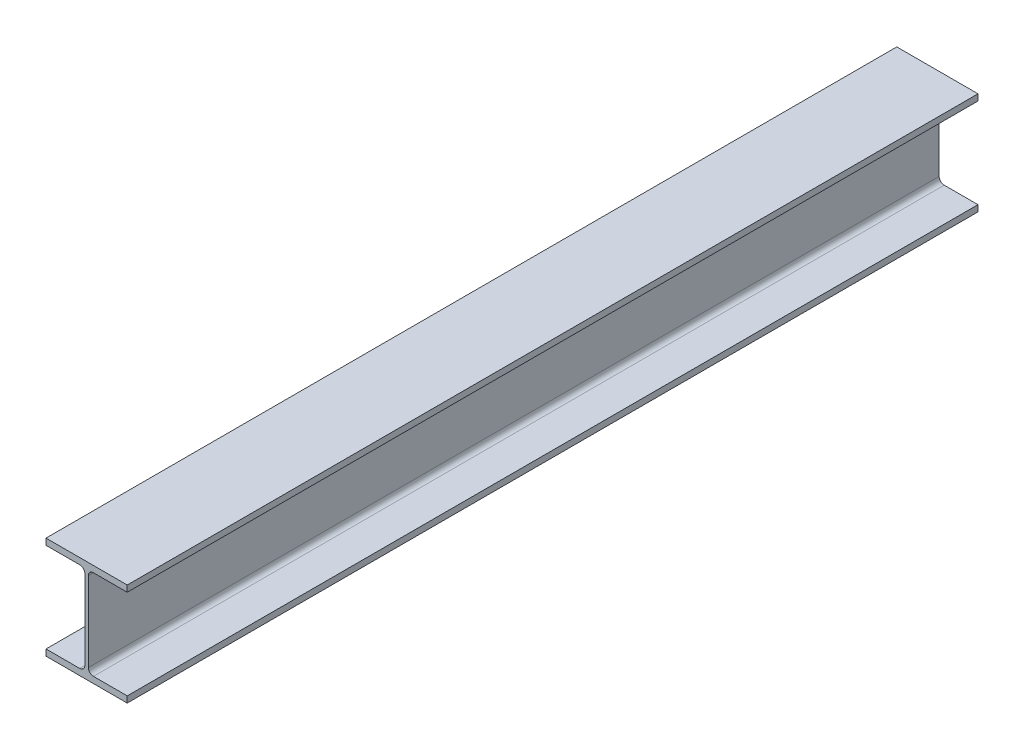
ISO-10303-21;
HEADER;
FILE_DESCRIPTION(('STEP AP214'),'2;1');
FILE_NAME('part.step','',(''),(''),'','','');
FILE_SCHEMA(('AUTOMOTIVE_DESIGN { 1 0 10303 214 1 1 1 1 }'));
ENDSEC;
DATA;
#1=APPLICATION_CONTEXT('core data for automotive mechanical design processes');
#2=APPLICATION_PROTOCOL_DEFINITION('international standard','automotive_design',2000,#1);
#3=PRODUCT_CONTEXT('',#1,'mechanical');
#4=PRODUCT('Part','Part','',(#3));
#5=PRODUCT_RELATED_PRODUCT_CATEGORY('part','',(#4));
#6=PRODUCT_DEFINITION_FORMATION('','',#4);
#7=PRODUCT_DEFINITION_CONTEXT('part definition',#1,'design');
#8=PRODUCT_DEFINITION('design','',#6,#7);
#9=PRODUCT_DEFINITION_SHAPE('','',#8);
#10=(LENGTH_UNIT() NAMED_UNIT(*) SI_UNIT(.MILLI.,.METRE.));
#11=(NAMED_UNIT(*) PLANE_ANGLE_UNIT() SI_UNIT($,.RADIAN.));
#12=(NAMED_UNIT(*) SI_UNIT($,.STERADIAN.) SOLID_ANGLE_UNIT());
#13=UNCERTAINTY_MEASURE_WITH_UNIT(LENGTH_MEASURE(1.E-05),#10,'distance_accuracy_value','');
#14=(GEOMETRIC_REPRESENTATION_CONTEXT(3) GLOBAL_UNCERTAINTY_ASSIGNED_CONTEXT((#13)) GLOBAL_UNIT_ASSIGNED_CONTEXT((#10,
#11,#12)) REPRESENTATION_CONTEXT('',''));
#15=CARTESIAN_POINT('',(0.,0.,0.));
#16=DIRECTION('',(0.,0.,1.));
#17=DIRECTION('',(1.,0.,0.));
#18=AXIS2_PLACEMENT_3D('',#15,#16,#17);
#19=CARTESIAN_POINT('',(203.708,0.,-1066.8));
#20=DIRECTION('',(0.,-1.,0.));
#21=DIRECTION('',(0.,0.,-1.));
#22=AXIS2_PLACEMENT_3D('',#19,#20,#21);
#23=PLANE('',#22);
#24=DIRECTION('',(1.,0.,0.));
#25=VECTOR('',#24,1.);
#26=CARTESIAN_POINT('',(203.708,0.,1066.8));
#27=LINE('',#26,#25);
#28=CARTESIAN_POINT('',(0.,0.,1066.8));
#29=VERTEX_POINT('',#28);
#30=CARTESIAN_POINT('',(203.708,0.,1066.8));
#31=VERTEX_POINT('',#30);
#32=EDGE_CURVE('E177',#29,#31,#27,.T.);
#33=ORIENTED_EDGE('',*,*,#32,.F.);
#34=DIRECTION('',(0.,0.,1.));
#35=VECTOR('',#34,1.);
#36=CARTESIAN_POINT('',(0.,0.,-1066.8));
#37=LINE('',#36,#35);
#38=CARTESIAN_POINT('',(0.,0.,-1066.8));
#39=VERTEX_POINT('',#38);
#40=EDGE_CURVE('E11',#39,#29,#37,.T.);
#41=ORIENTED_EDGE('',*,*,#40,.F.);
#42=DIRECTION('',(1.,0.,0.));
#43=VECTOR('',#42,1.);
#44=CARTESIAN_POINT('',(203.708,0.,-1066.8));
#45=LINE('',#44,#43);
#46=CARTESIAN_POINT('',(203.708,0.,-1066.8));
#47=VERTEX_POINT('',#46);
#48=EDGE_CURVE('E221',#39,#47,#45,.T.);
#49=ORIENTED_EDGE('',*,*,#48,.T.);
#50=DIRECTION('',(0.,0.,1.));
#51=VECTOR('',#50,1.);
#52=CARTESIAN_POINT('',(203.708,0.,-1066.8));
#53=LINE('',#52,#51);
#54=EDGE_CURVE('E35',#47,#31,#53,.T.);
#55=ORIENTED_EDGE('',*,*,#54,.T.);
#56=EDGE_LOOP('',(#33,#41,#49,#55));
#57=FACE_BOUND('',#56,.T.);
#58=ADVANCED_FACE('F32',(#57),#23,.T.);
#59=CARTESIAN_POINT('',(0.,0.,-1066.8));
#60=DIRECTION('',(-1.,0.,0.));
#61=DIRECTION('',(0.,-1.,0.));
#62=AXIS2_PLACEMENT_3D('',#59,#60,#61);
#63=PLANE('',#62);
#64=DIRECTION('',(0.,-1.,0.));
#65=VECTOR('',#64,1.);
#66=CARTESIAN_POINT('',(0.,0.,1066.8));
#67=LINE('',#66,#65);
#68=CARTESIAN_POINT('',(0.,15.748,1066.8));
#69=VERTEX_POINT('',#68);
#70=EDGE_CURVE('E219',#69,#29,#67,.T.);
#71=ORIENTED_EDGE('',*,*,#70,.F.);
#72=DIRECTION('',(0.,0.,1.));
#73=VECTOR('',#72,1.);
#74=CARTESIAN_POINT('',(0.,15.748,-1066.8));
#75=LINE('',#74,#73);
#76=CARTESIAN_POINT('',(0.,15.748,-1066.8));
#77=VERTEX_POINT('',#76);
#78=EDGE_CURVE('E41',#77,#69,#75,.T.);
#79=ORIENTED_EDGE('',*,*,#78,.F.);
#80=DIRECTION('',(0.,-1.,0.));
#81=VECTOR('',#80,1.);
#82=CARTESIAN_POINT('',(0.,0.,-1066.8));
#83=LINE('',#82,#81);
#84=EDGE_CURVE('E167',#77,#39,#83,.T.);
#85=ORIENTED_EDGE('',*,*,#84,.T.);
#86=ORIENTED_EDGE('',*,*,#40,.T.);
#87=EDGE_LOOP('',(#71,#79,#85,#86));
#88=FACE_BOUND('',#87,.T.);
#89=ADVANCED_FACE('F249',(#88),#63,.T.);
#90=CARTESIAN_POINT('',(0.,15.748,-1066.8));
#91=DIRECTION('',(0.,1.,0.));
#92=DIRECTION('',(-1.,0.,0.));
#93=AXIS2_PLACEMENT_3D('',#90,#91,#92);
#94=PLANE('',#93);
#95=DIRECTION('',(-1.,0.,0.));
#96=VECTOR('',#95,1.);
#97=CARTESIAN_POINT('',(0.,15.748,1066.8));
#98=LINE('',#97,#96);
#99=CARTESIAN_POINT('',(84.709,15.748,1066.8));
#100=VERTEX_POINT('',#99);
#101=EDGE_CURVE('E154',#100,#69,#98,.T.);
#102=ORIENTED_EDGE('',*,*,#101,.F.);
#103=DIRECTION('',(0.,0.,1.));
#104=VECTOR('',#103,1.);
#105=CARTESIAN_POINT('',(84.709,15.748,-1066.8));
#106=LINE('',#105,#104);
#107=CARTESIAN_POINT('',(84.709,15.748,-1066.8));
#108=VERTEX_POINT('',#107);
#109=EDGE_CURVE('E149',#108,#100,#106,.T.);
#110=ORIENTED_EDGE('',*,*,#109,.F.);
#111=DIRECTION('',(-1.,0.,0.));
#112=VECTOR('',#111,1.);
#113=CARTESIAN_POINT('',(0.,15.748,-1066.8));
#114=LINE('',#113,#112);
#115=EDGE_CURVE('E152',#108,#77,#114,.T.);
#116=ORIENTED_EDGE('',*,*,#115,.T.);
#117=ORIENTED_EDGE('',*,*,#78,.T.);
#118=EDGE_LOOP('',(#102,#110,#116,#117));
#119=FACE_BOUND('',#118,.T.);
#120=ADVANCED_FACE('F151',(#119),#94,.T.);
#121=CARTESIAN_POINT('',(84.709,28.448,-1066.8));
#122=DIRECTION('',(0.,0.,1.));
#123=DIRECTION('',(1.,0.,0.));
#124=AXIS2_PLACEMENT_3D('',#121,#122,#123);
#125=CYLINDRICAL_SURFACE('',#124,12.7);
#126=CARTESIAN_POINT('',(84.709,28.448,1066.8));
#127=DIRECTION('',(0.,0.,-1.));
#128=DIRECTION('',(1.,0.,0.));
#129=AXIS2_PLACEMENT_3D('',#126,#127,#128);
#130=CIRCLE('',#129,12.7);
#131=CARTESIAN_POINT('',(97.409,28.448,1066.8));
#132=VERTEX_POINT('',#131);
#133=EDGE_CURVE('E216',#132,#100,#130,.T.);
#134=ORIENTED_EDGE('',*,*,#133,.F.);
#135=DIRECTION('',(0.,0.,1.));
#136=VECTOR('',#135,1.);
#137=CARTESIAN_POINT('',(97.409,28.448,-1066.8));
#138=LINE('',#137,#136);
#139=CARTESIAN_POINT('',(97.409,28.448,-1066.8));
#140=VERTEX_POINT('',#139);
#141=EDGE_CURVE('E159',#140,#132,#138,.T.);
#142=ORIENTED_EDGE('',*,*,#141,.F.);
#143=CARTESIAN_POINT('',(84.709,28.448,-1066.8));
#144=DIRECTION('',(0.,0.,-1.));
#145=DIRECTION('',(1.,0.,0.));
#146=AXIS2_PLACEMENT_3D('',#143,#144,#145);
#147=CIRCLE('',#146,12.7);
#148=EDGE_CURVE('E165',#140,#108,#147,.T.);
#149=ORIENTED_EDGE('',*,*,#148,.T.);
#150=ORIENTED_EDGE('',*,*,#109,.T.);
#151=EDGE_LOOP('',(#134,#142,#149,#150));
#152=FACE_BOUND('',#151,.T.);
#153=ADVANCED_FACE('F169',(#152),#125,.F.);
#154=CARTESIAN_POINT('',(97.409,28.448,-1066.8));
#155=DIRECTION('',(-1.,0.,0.));
#156=DIRECTION('',(0.,-1.,0.));
#157=AXIS2_PLACEMENT_3D('',#154,#155,#156);
#158=PLANE('',#157);
#159=DIRECTION('',(0.,-1.,0.));
#160=VECTOR('',#159,1.);
#161=CARTESIAN_POINT('',(97.409,28.448,1066.8));
#162=LINE('',#161,#160);
#163=CARTESIAN_POINT('',(97.4089999999999,228.092,1066.8));
#164=VERTEX_POINT('',#163);
#165=EDGE_CURVE('E213',#164,#132,#162,.T.);
#166=ORIENTED_EDGE('',*,*,#165,.F.);
#167=DIRECTION('',(0.,0.,1.));
#168=VECTOR('',#167,1.);
#169=CARTESIAN_POINT('',(97.4089999999999,228.092,-1066.8));
#170=LINE('',#169,#168);
#171=CARTESIAN_POINT('',(97.4089999999999,228.092,-1066.8));
#172=VERTEX_POINT('',#171);
#173=EDGE_CURVE('E225',#172,#164,#170,.T.);
#174=ORIENTED_EDGE('',*,*,#173,.F.);
#175=DIRECTION('',(0.,-1.,0.));
#176=VECTOR('',#175,1.);
#177=CARTESIAN_POINT('',(97.409,28.448,-1066.8));
#178=LINE('',#177,#176);
#179=EDGE_CURVE('E170',#172,#140,#178,.T.);
#180=ORIENTED_EDGE('',*,*,#179,.T.);
#181=ORIENTED_EDGE('',*,*,#141,.T.);
#182=EDGE_LOOP('',(#166,#174,#180,#181));
#183=FACE_BOUND('',#182,.T.);
#184=ADVANCED_FACE('F262',(#183),#158,.T.);
#185=CARTESIAN_POINT('',(84.7089999999999,228.092,-1066.8));
#186=DIRECTION('',(0.,0.,1.));
#187=DIRECTION('',(1.,0.,0.));
#188=AXIS2_PLACEMENT_3D('',#185,#186,#187);
#189=CYLINDRICAL_SURFACE('',#188,12.7);
#190=CARTESIAN_POINT('',(84.7089999999999,228.092,1066.8));
#191=DIRECTION('',(0.,0.,-1.));
#192=DIRECTION('',(1.,0.,0.));
#193=AXIS2_PLACEMENT_3D('',#190,#191,#192);
#194=CIRCLE('',#193,12.7);
#195=CARTESIAN_POINT('',(84.7089999999999,240.792,1066.8));
#196=VERTEX_POINT('',#195);
#197=EDGE_CURVE('E210',#196,#164,#194,.T.);
#198=ORIENTED_EDGE('',*,*,#197,.F.);
#199=DIRECTION('',(0.,0.,1.));
#200=VECTOR('',#199,1.);
#201=CARTESIAN_POINT('',(84.7089999999999,240.792,-1066.8));
#202=LINE('',#201,#200);
#203=CARTESIAN_POINT('',(84.7089999999999,240.792,-1066.8));
#204=VERTEX_POINT('',#203);
#205=EDGE_CURVE('E227',#204,#196,#202,.T.);
#206=ORIENTED_EDGE('',*,*,#205,.F.);
#207=CARTESIAN_POINT('',(84.7089999999999,228.092,-1066.8));
#208=DIRECTION('',(0.,0.,-1.));
#209=DIRECTION('',(1.,0.,0.));
#210=AXIS2_PLACEMENT_3D('',#207,#208,#209);
#211=CIRCLE('',#210,12.7);
#212=EDGE_CURVE('E172',#204,#172,#211,.T.);
#213=ORIENTED_EDGE('',*,*,#212,.T.);
#214=ORIENTED_EDGE('',*,*,#173,.T.);
#215=EDGE_LOOP('',(#198,#206,#213,#214));
#216=FACE_BOUND('',#215,.T.);
#217=ADVANCED_FACE('F265',(#216),#189,.F.);
#218=CARTESIAN_POINT('',(84.7089999999999,240.792,-1066.8));
#219=DIRECTION('',(0.,-1.,0.));
#220=DIRECTION('',(0.,0.,-1.));
#221=AXIS2_PLACEMENT_3D('',#218,#219,#220);
#222=PLANE('',#221);
#223=DIRECTION('',(1.,0.,0.));
#224=VECTOR('',#223,1.);
#225=CARTESIAN_POINT('',(84.7089999999999,240.792,1066.8));
#226=LINE('',#225,#224);
#227=CARTESIAN_POINT('',(0.,240.792,1066.8));
#228=VERTEX_POINT('',#227);
#229=EDGE_CURVE('E207',#228,#196,#226,.T.);
#230=ORIENTED_EDGE('',*,*,#229,.F.);
#231=DIRECTION('',(0.,0.,1.));
#232=VECTOR('',#231,1.);
#233=CARTESIAN_POINT('',(0.,240.792,-1066.8));
#234=LINE('',#233,#232);
#235=CARTESIAN_POINT('',(0.,240.792,-1066.8));
#236=VERTEX_POINT('',#235);
#237=EDGE_CURVE('E229',#236,#228,#234,.T.);
#238=ORIENTED_EDGE('',*,*,#237,.F.);
#239=DIRECTION('',(1.,0.,0.));
#240=VECTOR('',#239,1.);
#241=CARTESIAN_POINT('',(84.7089999999999,240.792,-1066.8));
#242=LINE('',#241,#240);
#243=EDGE_CURVE('E446',#236,#204,#242,.T.);
#244=ORIENTED_EDGE('',*,*,#243,.T.);
#245=ORIENTED_EDGE('',*,*,#205,.T.);
#246=EDGE_LOOP('',(#230,#238,#244,#245));
#247=FACE_BOUND('',#246,.T.);
#248=ADVANCED_FACE('F269',(#247),#222,.T.);
#249=CARTESIAN_POINT('',(0.,240.792,-1066.8));
#250=DIRECTION('',(-1.,0.,0.));
#251=DIRECTION('',(0.,-1.,0.));
#252=AXIS2_PLACEMENT_3D('',#249,#250,#251);
#253=PLANE('',#252);
#254=DIRECTION('',(0.,-1.,0.));
#255=VECTOR('',#254,1.);
#256=CARTESIAN_POINT('',(0.,240.792,1066.8));
#257=LINE('',#256,#255);
#258=CARTESIAN_POINT('',(0.,256.54,1066.8));
#259=VERTEX_POINT('',#258);
#260=EDGE_CURVE('E204',#259,#228,#257,.T.);
#261=ORIENTED_EDGE('',*,*,#260,.F.);
#262=DIRECTION('',(0.,0.,1.));
#263=VECTOR('',#262,1.);
#264=CARTESIAN_POINT('',(0.,256.54,-1066.8));
#265=LINE('',#264,#263);
#266=CARTESIAN_POINT('',(0.,256.54,-1066.8));
#267=VERTEX_POINT('',#266);
#268=EDGE_CURVE('E231',#267,#259,#265,.T.);
#269=ORIENTED_EDGE('',*,*,#268,.F.);
#270=DIRECTION('',(0.,-1.,0.));
#271=VECTOR('',#270,1.);
#272=CARTESIAN_POINT('',(0.,240.792,-1066.8));
#273=LINE('',#272,#271);
#274=EDGE_CURVE('E442',#267,#236,#273,.T.);
#275=ORIENTED_EDGE('',*,*,#274,.T.);
#276=ORIENTED_EDGE('',*,*,#237,.T.);
#277=EDGE_LOOP('',(#261,#269,#275,#276));
#278=FACE_BOUND('',#277,.T.);
#279=ADVANCED_FACE('F273',(#278),#253,.T.);
#280=CARTESIAN_POINT('',(0.,256.54,-1066.8));
#281=DIRECTION('',(0.,1.,0.));
#282=DIRECTION('',(0.,0.,1.));
#283=AXIS2_PLACEMENT_3D('',#280,#281,#282);
#284=PLANE('',#283);
#285=DIRECTION('',(-1.,0.,0.));
#286=VECTOR('',#285,1.);
#287=CARTESIAN_POINT('',(0.,256.54,1066.8));
#288=LINE('',#287,#286);
#289=CARTESIAN_POINT('',(203.708,256.54,1066.8));
#290=VERTEX_POINT('',#289);
#291=EDGE_CURVE('E201',#290,#259,#288,.T.);
#292=ORIENTED_EDGE('',*,*,#291,.F.);
#293=DIRECTION('',(0.,0.,1.));
#294=VECTOR('',#293,1.);
#295=CARTESIAN_POINT('',(203.708,256.54,-1066.8));
#296=LINE('',#295,#294);
#297=CARTESIAN_POINT('',(203.708,256.54,-1066.8));
#298=VERTEX_POINT('',#297);
#299=EDGE_CURVE('E233',#298,#290,#296,.T.);
#300=ORIENTED_EDGE('',*,*,#299,.F.);
#301=DIRECTION('',(-1.,0.,0.));
#302=VECTOR('',#301,1.);
#303=CARTESIAN_POINT('',(0.,256.54,-1066.8));
#304=LINE('',#303,#302);
#305=EDGE_CURVE('E453',#298,#267,#304,.T.);
#306=ORIENTED_EDGE('',*,*,#305,.T.);
#307=ORIENTED_EDGE('',*,*,#268,.T.);
#308=EDGE_LOOP('',(#292,#300,#306,#307));
#309=FACE_BOUND('',#308,.T.);
#310=ADVANCED_FACE('F277',(#309),#284,.T.);
#311=CARTESIAN_POINT('',(203.708,256.54,-1066.8));
#312=DIRECTION('',(1.,0.,0.));
#313=DIRECTION('',(0.,1.,0.));
#314=AXIS2_PLACEMENT_3D('',#311,#312,#313);
#315=PLANE('',#314);
#316=DIRECTION('',(0.,1.,0.));
#317=VECTOR('',#316,1.);
#318=CARTESIAN_POINT('',(203.708,256.54,1066.8));
#319=LINE('',#318,#317);
#320=CARTESIAN_POINT('',(203.708,240.792,1066.8));
#321=VERTEX_POINT('',#320);
#322=EDGE_CURVE('E198',#321,#290,#319,.T.);
#323=ORIENTED_EDGE('',*,*,#322,.F.);
#324=DIRECTION('',(0.,0.,1.));
#325=VECTOR('',#324,1.);
#326=CARTESIAN_POINT('',(203.708,240.792,-1066.8));
#327=LINE('',#326,#325);
#328=CARTESIAN_POINT('',(203.708,240.792,-1066.8));
#329=VERTEX_POINT('',#328);
#330=EDGE_CURVE('E235',#329,#321,#327,.T.);
#331=ORIENTED_EDGE('',*,*,#330,.F.);
#332=DIRECTION('',(0.,1.,0.));
#333=VECTOR('',#332,1.);
#334=CARTESIAN_POINT('',(203.708,256.54,-1066.8));
#335=LINE('',#334,#333);
#336=EDGE_CURVE('E435',#329,#298,#335,.T.);
#337=ORIENTED_EDGE('',*,*,#336,.T.);
#338=ORIENTED_EDGE('',*,*,#299,.T.);
#339=EDGE_LOOP('',(#323,#331,#337,#338));
#340=FACE_BOUND('',#339,.T.);
#341=ADVANCED_FACE('F281',(#340),#315,.T.);
#342=CARTESIAN_POINT('',(203.708,240.792,-1066.8));
#343=DIRECTION('',(0.,-1.,0.));
#344=DIRECTION('',(0.,0.,-1.));
#345=AXIS2_PLACEMENT_3D('',#342,#343,#344);
#346=PLANE('',#345);
#347=DIRECTION('',(1.,0.,0.));
#348=VECTOR('',#347,1.);
#349=CARTESIAN_POINT('',(203.708,240.792,1066.8));
#350=LINE('',#349,#348);
#351=CARTESIAN_POINT('',(118.999,240.792,1066.8));
#352=VERTEX_POINT('',#351);
#353=EDGE_CURVE('E195',#352,#321,#350,.T.);
#354=ORIENTED_EDGE('',*,*,#353,.F.);
#355=DIRECTION('',(0.,0.,1.));
#356=VECTOR('',#355,1.);
#357=CARTESIAN_POINT('',(118.999,240.792,-1066.8));
#358=LINE('',#357,#356);
#359=CARTESIAN_POINT('',(118.999,240.792,-1066.8));
#360=VERTEX_POINT('',#359);
#361=EDGE_CURVE('E237',#360,#352,#358,.T.);
#362=ORIENTED_EDGE('',*,*,#361,.F.);
#363=DIRECTION('',(1.,0.,0.));
#364=VECTOR('',#363,1.);
#365=CARTESIAN_POINT('',(203.708,240.792,-1066.8));
#366=LINE('',#365,#364);
#367=EDGE_CURVE('E431',#360,#329,#366,.T.);
#368=ORIENTED_EDGE('',*,*,#367,.T.);
#369=ORIENTED_EDGE('',*,*,#330,.T.);
#370=EDGE_LOOP('',(#354,#362,#368,#369));
#371=FACE_BOUND('',#370,.T.);
#372=ADVANCED_FACE('F285',(#371),#346,.T.);
#373=CARTESIAN_POINT('',(118.999,228.092,-1066.8));
#374=DIRECTION('',(0.,0.,1.));
#375=DIRECTION('',(1.,0.,0.));
#376=AXIS2_PLACEMENT_3D('',#373,#374,#375);
#377=CYLINDRICAL_SURFACE('',#376,12.7);
#378=CARTESIAN_POINT('',(118.999,228.092,1066.8));
#379=DIRECTION('',(0.,0.,-1.));
#380=DIRECTION('',(1.,0.,0.));
#381=AXIS2_PLACEMENT_3D('',#378,#379,#380);
#382=CIRCLE('',#381,12.7);
#383=CARTESIAN_POINT('',(106.299,228.092,1066.8));
#384=VERTEX_POINT('',#383);
#385=EDGE_CURVE('E192',#384,#352,#382,.T.);
#386=ORIENTED_EDGE('',*,*,#385,.F.);
#387=DIRECTION('',(0.,0.,1.));
#388=VECTOR('',#387,1.);
#389=CARTESIAN_POINT('',(106.299,228.092,-1066.8));
#390=LINE('',#389,#388);
#391=CARTESIAN_POINT('',(106.299,228.092,-1066.8));
#392=VERTEX_POINT('',#391);
#393=EDGE_CURVE('E239',#392,#384,#390,.T.);
#394=ORIENTED_EDGE('',*,*,#393,.F.);
#395=CARTESIAN_POINT('',(118.999,228.092,-1066.8));
#396=DIRECTION('',(0.,0.,-1.));
#397=DIRECTION('',(1.,0.,0.));
#398=AXIS2_PLACEMENT_3D('',#395,#396,#397);
#399=CIRCLE('',#398,12.7);
#400=EDGE_CURVE('E457',#392,#360,#399,.T.);
#401=ORIENTED_EDGE('',*,*,#400,.T.);
#402=ORIENTED_EDGE('',*,*,#361,.T.);
#403=EDGE_LOOP('',(#386,#394,#401,#402));
#404=FACE_BOUND('',#403,.T.);
#405=ADVANCED_FACE('F289',(#404),#377,.F.);
#406=CARTESIAN_POINT('',(106.299,228.092,-1066.8));
#407=DIRECTION('',(1.,0.,0.));
#408=DIRECTION('',(0.,1.,0.));
#409=AXIS2_PLACEMENT_3D('',#406,#407,#408);
#410=PLANE('',#409);
#411=DIRECTION('',(0.,1.,0.));
#412=VECTOR('',#411,1.);
#413=CARTESIAN_POINT('',(106.299,228.092,1066.8));
#414=LINE('',#413,#412);
#415=CARTESIAN_POINT('',(106.299,28.448,1066.8));
#416=VERTEX_POINT('',#415);
#417=EDGE_CURVE('E189',#416,#384,#414,.T.);
#418=ORIENTED_EDGE('',*,*,#417,.F.);
#419=DIRECTION('',(0.,0.,1.));
#420=VECTOR('',#419,1.);
#421=CARTESIAN_POINT('',(106.299,28.448,-1066.8));
#422=LINE('',#421,#420);
#423=CARTESIAN_POINT('',(106.299,28.448,-1066.8));
#424=VERTEX_POINT('',#423);
#425=EDGE_CURVE('E241',#424,#416,#422,.T.);
#426=ORIENTED_EDGE('',*,*,#425,.F.);
#427=DIRECTION('',(0.,1.,0.));
#428=VECTOR('',#427,1.);
#429=CARTESIAN_POINT('',(106.299,228.092,-1066.8));
#430=LINE('',#429,#428);
#431=EDGE_CURVE('E424',#424,#392,#430,.T.);
#432=ORIENTED_EDGE('',*,*,#431,.T.);
#433=ORIENTED_EDGE('',*,*,#393,.T.);
#434=EDGE_LOOP('',(#418,#426,#432,#433));
#435=FACE_BOUND('',#434,.T.);
#436=ADVANCED_FACE('F293',(#435),#410,.T.);
#437=CARTESIAN_POINT('',(118.999,28.448,-1066.8));
#438=DIRECTION('',(0.,0.,1.));
#439=DIRECTION('',(1.,0.,0.));
#440=AXIS2_PLACEMENT_3D('',#437,#438,#439);
#441=CYLINDRICAL_SURFACE('',#440,12.7);
#442=CARTESIAN_POINT('',(118.999,28.448,1066.8));
#443=DIRECTION('',(0.,0.,-1.));
#444=DIRECTION('',(1.,0.,0.));
#445=AXIS2_PLACEMENT_3D('',#442,#443,#444);
#446=CIRCLE('',#445,12.7);
#447=CARTESIAN_POINT('',(118.999,15.748,1066.8));
#448=VERTEX_POINT('',#447);
#449=EDGE_CURVE('E186',#448,#416,#446,.T.);
#450=ORIENTED_EDGE('',*,*,#449,.F.);
#451=DIRECTION('',(0.,0.,1.));
#452=VECTOR('',#451,1.);
#453=CARTESIAN_POINT('',(118.999,15.748,-1066.8));
#454=LINE('',#453,#452);
#455=CARTESIAN_POINT('',(118.999,15.748,-1066.8));
#456=VERTEX_POINT('',#455);
#457=EDGE_CURVE('E243',#456,#448,#454,.T.);
#458=ORIENTED_EDGE('',*,*,#457,.F.);
#459=CARTESIAN_POINT('',(118.999,28.448,-1066.8));
#460=DIRECTION('',(0.,0.,-1.));
#461=DIRECTION('',(1.,0.,0.));
#462=AXIS2_PLACEMENT_3D('',#459,#460,#461);
#463=CIRCLE('',#462,12.7);
#464=EDGE_CURVE('E420',#456,#424,#463,.T.);
#465=ORIENTED_EDGE('',*,*,#464,.T.);
#466=ORIENTED_EDGE('',*,*,#425,.T.);
#467=EDGE_LOOP('',(#450,#458,#465,#466));
#468=FACE_BOUND('',#467,.T.);
#469=ADVANCED_FACE('F297',(#468),#441,.F.);
#470=CARTESIAN_POINT('',(118.999,15.748,-1066.8));
#471=DIRECTION('',(0.,1.,0.));
#472=DIRECTION('',(-1.,0.,0.));
#473=AXIS2_PLACEMENT_3D('',#470,#471,#472);
#474=PLANE('',#473);
#475=DIRECTION('',(-1.,0.,0.));
#476=VECTOR('',#475,1.);
#477=CARTESIAN_POINT('',(118.999,15.748,1066.8));
#478=LINE('',#477,#476);
#479=CARTESIAN_POINT('',(203.708,15.748,1066.8));
#480=VERTEX_POINT('',#479);
#481=EDGE_CURVE('E183',#480,#448,#478,.T.);
#482=ORIENTED_EDGE('',*,*,#481,.F.);
#483=DIRECTION('',(0.,0.,1.));
#484=VECTOR('',#483,1.);
#485=CARTESIAN_POINT('',(203.708,15.748,-1066.8));
#486=LINE('',#485,#484);
#487=CARTESIAN_POINT('',(203.708,15.748,-1066.8));
#488=VERTEX_POINT('',#487);
#489=EDGE_CURVE('E244',#488,#480,#486,.T.);
#490=ORIENTED_EDGE('',*,*,#489,.F.);
#491=DIRECTION('',(-1.,0.,0.));
#492=VECTOR('',#491,1.);
#493=CARTESIAN_POINT('',(118.999,15.748,-1066.8));
#494=LINE('',#493,#492);
#495=EDGE_CURVE('E461',#488,#456,#494,.T.);
#496=ORIENTED_EDGE('',*,*,#495,.T.);
#497=ORIENTED_EDGE('',*,*,#457,.T.);
#498=EDGE_LOOP('',(#482,#490,#496,#497));
#499=FACE_BOUND('',#498,.T.);
#500=ADVANCED_FACE('F301',(#499),#474,.T.);
#501=CARTESIAN_POINT('',(203.708,15.748,-1066.8));
#502=DIRECTION('',(1.,0.,0.));
#503=DIRECTION('',(0.,0.,-1.));
#504=AXIS2_PLACEMENT_3D('',#501,#502,#503);
#505=PLANE('',#504);
#506=DIRECTION('',(0.,1.,0.));
#507=VECTOR('',#506,1.);
#508=CARTESIAN_POINT('',(203.708,15.748,1066.8));
#509=LINE('',#508,#507);
#510=EDGE_CURVE('E180',#31,#480,#509,.T.);
#511=ORIENTED_EDGE('',*,*,#510,.F.);
#512=ORIENTED_EDGE('',*,*,#54,.F.);
#513=DIRECTION('',(0.,1.,0.));
#514=VECTOR('',#513,1.);
#515=CARTESIAN_POINT('',(203.708,15.748,-1066.8));
#516=LINE('',#515,#514);
#517=EDGE_CURVE('E463',#47,#488,#516,.T.);
#518=ORIENTED_EDGE('',*,*,#517,.T.);
#519=ORIENTED_EDGE('',*,*,#489,.T.);
#520=EDGE_LOOP('',(#511,#512,#518,#519));
#521=FACE_BOUND('',#520,.T.);
#522=ADVANCED_FACE('F246',(#521),#505,.T.);
#523=CARTESIAN_POINT('',(84.709,28.448,-1066.8));
#524=DIRECTION('',(0.,0.,1.));
#525=DIRECTION('',(1.,0.,0.));
#526=AXIS2_PLACEMENT_3D('',#523,#524,#525);
#527=PLANE('',#526);
#528=ORIENTED_EDGE('',*,*,#48,.F.);
#529=ORIENTED_EDGE('',*,*,#84,.F.);
#530=ORIENTED_EDGE('',*,*,#115,.F.);
#531=ORIENTED_EDGE('',*,*,#148,.F.);
#532=ORIENTED_EDGE('',*,*,#179,.F.);
#533=ORIENTED_EDGE('',*,*,#212,.F.);
#534=ORIENTED_EDGE('',*,*,#243,.F.);
#535=ORIENTED_EDGE('',*,*,#274,.F.);
#536=ORIENTED_EDGE('',*,*,#305,.F.);
#537=ORIENTED_EDGE('',*,*,#336,.F.);
#538=ORIENTED_EDGE('',*,*,#367,.F.);
#539=ORIENTED_EDGE('',*,*,#400,.F.);
#540=ORIENTED_EDGE('',*,*,#431,.F.);
#541=ORIENTED_EDGE('',*,*,#464,.F.);
#542=ORIENTED_EDGE('',*,*,#495,.F.);
#543=ORIENTED_EDGE('',*,*,#517,.F.);
#544=EDGE_LOOP('',(#528,#529,#530,#531,#532,#533,#534,#535,#536,#537,#538,#539,#540,#541,#542,#543));
#545=FACE_BOUND('',#544,.T.);
#546=ADVANCED_FACE('F163',(#545),#527,.F.);
#547=CARTESIAN_POINT('',(84.709,28.448,1066.8));
#548=DIRECTION('',(0.,0.,1.));
#549=DIRECTION('',(1.,0.,0.));
#550=AXIS2_PLACEMENT_3D('',#547,#548,#549);
#551=PLANE('',#550);
#552=ORIENTED_EDGE('',*,*,#32,.T.);
#553=ORIENTED_EDGE('',*,*,#510,.T.);
#554=ORIENTED_EDGE('',*,*,#481,.T.);
#555=ORIENTED_EDGE('',*,*,#449,.T.);
#556=ORIENTED_EDGE('',*,*,#417,.T.);
#557=ORIENTED_EDGE('',*,*,#385,.T.);
#558=ORIENTED_EDGE('',*,*,#353,.T.);
#559=ORIENTED_EDGE('',*,*,#322,.T.);
#560=ORIENTED_EDGE('',*,*,#291,.T.);
#561=ORIENTED_EDGE('',*,*,#260,.T.);
#562=ORIENTED_EDGE('',*,*,#229,.T.);
#563=ORIENTED_EDGE('',*,*,#197,.T.);
#564=ORIENTED_EDGE('',*,*,#165,.T.);
#565=ORIENTED_EDGE('',*,*,#133,.T.);
#566=ORIENTED_EDGE('',*,*,#101,.T.);
#567=ORIENTED_EDGE('',*,*,#70,.T.);
#568=EDGE_LOOP('',(#552,#553,#554,#555,#556,#557,#558,#559,#560,#561,#562,#563,#564,#565,#566,#567));
#569=FACE_BOUND('',#568,.T.);
#570=ADVANCED_FACE('F248',(#569),#551,.T.);
#571=CLOSED_SHELL('',(#58,#89,#120,#153,#184,#217,#248,#279,#310,#341,#372,#405,#436,#469,#500,
#522,#546,#570));
#572=MANIFOLD_SOLID_BREP('B2',#571);
#573=ADVANCED_BREP_SHAPE_REPRESENTATION('',(#18,#572),#14);
#574=SHAPE_DEFINITION_REPRESENTATION(#9,#573);
ENDSEC;
END-ISO-10303-21;
